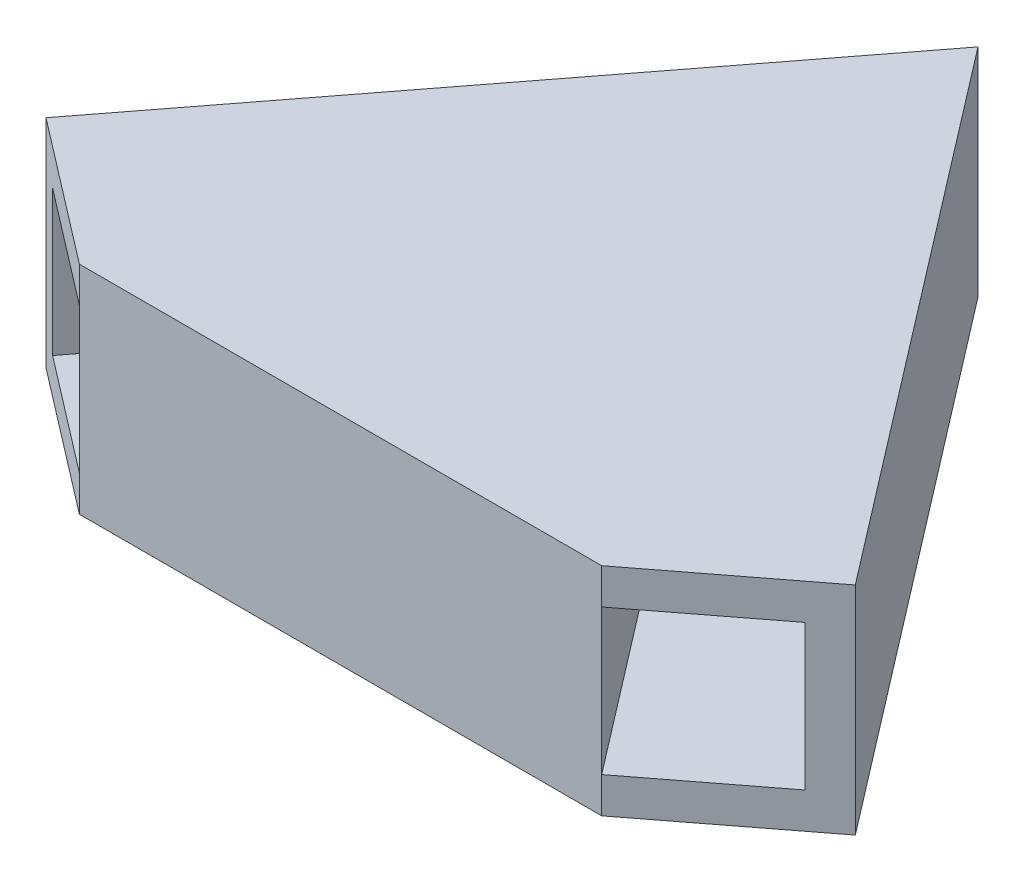
ISO-10303-21;
HEADER;
FILE_DESCRIPTION(('STEP AP214'),'2;1');
FILE_NAME('part.step','',(''),(''),'','','');
FILE_SCHEMA(('AUTOMOTIVE_DESIGN { 1 0 10303 214 1 1 1 1 }'));
ENDSEC;
DATA;
#1=APPLICATION_CONTEXT('core data for automotive mechanical design processes');
#2=APPLICATION_PROTOCOL_DEFINITION('international standard','automotive_design',2000,#1);
#3=PRODUCT_CONTEXT('',#1,'mechanical');
#4=PRODUCT('Part','Part','',(#3));
#5=PRODUCT_RELATED_PRODUCT_CATEGORY('part','',(#4));
#6=PRODUCT_DEFINITION_FORMATION('','',#4);
#7=PRODUCT_DEFINITION_CONTEXT('part definition',#1,'design');
#8=PRODUCT_DEFINITION('design','',#6,#7);
#9=PRODUCT_DEFINITION_SHAPE('','',#8);
#10=(LENGTH_UNIT() NAMED_UNIT(*) SI_UNIT(.MILLI.,.METRE.));
#11=(NAMED_UNIT(*) PLANE_ANGLE_UNIT() SI_UNIT($,.RADIAN.));
#12=(NAMED_UNIT(*) SI_UNIT($,.STERADIAN.) SOLID_ANGLE_UNIT());
#13=UNCERTAINTY_MEASURE_WITH_UNIT(LENGTH_MEASURE(1.E-05),#10,'distance_accuracy_value','');
#14=(GEOMETRIC_REPRESENTATION_CONTEXT(3) GLOBAL_UNCERTAINTY_ASSIGNED_CONTEXT((#13)) GLOBAL_UNIT_ASSIGNED_CONTEXT((#10,
#11,#12)) REPRESENTATION_CONTEXT('',''));
#15=CARTESIAN_POINT('',(0.,0.,0.));
#16=DIRECTION('',(0.,0.,1.));
#17=DIRECTION('',(1.,0.,0.));
#18=AXIS2_PLACEMENT_3D('',#15,#16,#17);
#19=CARTESIAN_POINT('',(0.,5.,0.));
#20=DIRECTION('',(0.,-1.,0.));
#21=DIRECTION('',(0.,0.,-1.));
#22=AXIS2_PLACEMENT_3D('',#19,#20,#21);
#23=PLANE('',#22);
#24=DIRECTION('',(-0.608761429008711,0.,0.793353340291243));
#25=VECTOR('',#24,1.);
#26=CARTESIAN_POINT('',(-36.5256857405226,5.,47.6012004174746));
#27=LINE('',#26,#25);
#28=CARTESIAN_POINT('',(-0.926476193621818,5.,1.20740728286133));
#29=VERTEX_POINT('',#28);
#30=CARTESIAN_POINT('',(-36.5256857405226,5.,47.6012004174746));
#31=VERTEX_POINT('',#30);
#32=EDGE_CURVE('E181',#29,#31,#27,.T.);
#33=ORIENTED_EDGE('',*,*,#32,.F.);
#34=DIRECTION('',(0.793353340291243,0.,0.608761429008711));
#35=VECTOR('',#34,1.);
#36=CARTESIAN_POINT('',(-17.0315490015341,5.,-11.1504497260155));
#37=LINE('',#36,#35);
#38=CARTESIAN_POINT('',(-17.0315490015341,5.,-11.1504497260155));
#39=VERTEX_POINT('',#38);
#40=EDGE_CURVE('E192',#39,#29,#37,.T.);
#41=ORIENTED_EDGE('',*,*,#40,.F.);
#42=DIRECTION('',(0.608761429008711,0.,-0.793353340291243));
#43=VECTOR('',#42,1.);
#44=CARTESIAN_POINT('',(0.,5.,-33.3463965236036));
#45=LINE('',#44,#43);
#46=CARTESIAN_POINT('',(-52.6307585484349,5.,35.2433434085977));
#47=VERTEX_POINT('',#46);
#48=EDGE_CURVE('E211',#47,#39,#45,.T.);
#49=ORIENTED_EDGE('',*,*,#48,.F.);
#50=DIRECTION('',(0.793353340291243,0.,0.60876142900871));
#51=VECTOR('',#50,1.);
#52=CARTESIAN_POINT('',(-36.5256857405226,5.,47.6012004174746));
#53=LINE('',#52,#51);
#54=EDGE_CURVE('E221',#47,#31,#53,.T.);
#55=ORIENTED_EDGE('',*,*,#54,.T.);
#56=EDGE_LOOP('',(#33,#41,#49,#55));
#57=FACE_BOUND('',#56,.T.);
#58=ADVANCED_FACE('F32',(#57),#23,.F.);
#59=CARTESIAN_POINT('',(0.,25.3,0.));
#60=DIRECTION('',(0.,1.,0.));
#61=DIRECTION('',(0.,0.,1.));
#62=AXIS2_PLACEMENT_3D('',#59,#60,#61);
#63=PLANE('',#62);
#64=DIRECTION('',(-0.608761429008711,0.,0.793353340291243));
#65=VECTOR('',#64,1.);
#66=CARTESIAN_POINT('',(-36.5256857405226,25.3,47.6012004174746));
#67=LINE('',#66,#65);
#68=CARTESIAN_POINT('',(-0.926476193621812,25.3,1.20740728286134));
#69=VERTEX_POINT('',#68);
#70=CARTESIAN_POINT('',(-36.5256857405226,25.3,47.6012004174746));
#71=VERTEX_POINT('',#70);
#72=EDGE_CURVE('E184',#69,#71,#67,.T.);
#73=ORIENTED_EDGE('',*,*,#72,.T.);
#74=DIRECTION('',(0.793353340291243,0.,0.60876142900871));
#75=VECTOR('',#74,1.);
#76=CARTESIAN_POINT('',(-56.5975252498911,25.3,32.1995362635542));
#77=LINE('',#76,#75);
#78=CARTESIAN_POINT('',(-52.6307585484349,25.3,35.2433434085977));
#79=VERTEX_POINT('',#78);
#80=EDGE_CURVE('E197',#79,#71,#77,.T.);
#81=ORIENTED_EDGE('',*,*,#80,.F.);
#82=DIRECTION('',(0.608761429008711,0.,-0.793353340291243));
#83=VECTOR('',#82,1.);
#84=CARTESIAN_POINT('',(0.,25.3,-33.3463965236036));
#85=LINE('',#84,#83);
#86=CARTESIAN_POINT('',(-17.0315490015341,25.3,-11.1504497260155));
#87=VERTEX_POINT('',#86);
#88=EDGE_CURVE('E212',#79,#87,#85,.T.);
#89=ORIENTED_EDGE('',*,*,#88,.T.);
#90=DIRECTION('',(0.793353340291243,0.,0.608761429008711));
#91=VECTOR('',#90,1.);
#92=CARTESIAN_POINT('',(-17.0315490015341,25.3,-11.1504497260155));
#93=LINE('',#92,#91);
#94=EDGE_CURVE('E194',#87,#69,#93,.T.);
#95=ORIENTED_EDGE('',*,*,#94,.T.);
#96=EDGE_LOOP('',(#73,#81,#89,#95));
#97=FACE_BOUND('',#96,.T.);
#98=ADVANCED_FACE('F273',(#97),#63,.F.);
#99=CARTESIAN_POINT('',(-17.0315490015341,64.4621464483065,-11.1504497260155));
#100=DIRECTION('',(0.608761429008711,0.,-0.793353340291243));
#101=DIRECTION('',(-0.793353340291243,0.,-0.608761429008711));
#102=AXIS2_PLACEMENT_3D('',#99,#100,#101);
#103=PLANE('',#102);
#104=DIRECTION('',(0.,-1.,0.));
#105=VECTOR('',#104,1.);
#106=CARTESIAN_POINT('',(-0.926476193621818,84.3466744214499,1.20740728286133));
#107=LINE('',#106,#105);
#108=EDGE_CURVE('E185',#69,#29,#107,.T.);
#109=ORIENTED_EDGE('',*,*,#108,.F.);
#110=ORIENTED_EDGE('',*,*,#94,.F.);
#111=DIRECTION('',(0.,-1.,0.));
#112=VECTOR('',#111,1.);
#113=CARTESIAN_POINT('',(-17.0315490015341,64.4621464483065,-11.1504497260155));
#114=LINE('',#113,#112);
#115=EDGE_CURVE('E187',#87,#39,#114,.T.);
#116=ORIENTED_EDGE('',*,*,#115,.T.);
#117=ORIENTED_EDGE('',*,*,#40,.T.);
#118=EDGE_LOOP('',(#109,#110,#116,#117));
#119=FACE_BOUND('',#118,.T.);
#120=ADVANCED_FACE('F275',(#119),#103,.F.);
#121=CARTESIAN_POINT('',(0.,25.3,-33.3463965236036));
#122=DIRECTION('',(-0.793353340291243,0.,-0.608761429008711));
#123=DIRECTION('',(-0.608761429008711,0.,0.793353340291243));
#124=AXIS2_PLACEMENT_3D('',#121,#122,#123);
#125=PLANE('',#124);
#126=ORIENTED_EDGE('',*,*,#115,.F.);
#127=ORIENTED_EDGE('',*,*,#88,.F.);
#128=DIRECTION('',(0.,-1.,0.));
#129=VECTOR('',#128,1.);
#130=CARTESIAN_POINT('',(-52.6307585484349,25.3,35.2433434085977));
#131=LINE('',#130,#129);
#132=EDGE_CURVE('E215',#79,#47,#131,.T.);
#133=ORIENTED_EDGE('',*,*,#132,.T.);
#134=ORIENTED_EDGE('',*,*,#48,.T.);
#135=EDGE_LOOP('',(#126,#127,#133,#134));
#136=FACE_BOUND('',#135,.T.);
#137=ADVANCED_FACE('F270',(#136),#125,.F.);
#138=CARTESIAN_POINT('',(-36.5256857405226,5.,47.6012004174746));
#139=DIRECTION('',(0.60876142900871,0.,-0.793353340291243));
#140=DIRECTION('',(-0.793353340291243,0.,-0.608761429008711));
#141=AXIS2_PLACEMENT_3D('',#138,#139,#140);
#142=PLANE('',#141);
#143=DIRECTION('',(0.793353340291243,0.,0.60876142900871));
#144=VECTOR('',#143,1.);
#145=CARTESIAN_POINT('',(-36.5256857405226,0.,47.6012004174746));
#146=LINE('',#145,#144);
#147=CARTESIAN_POINT('',(-56.5975252498911,0.,32.1995362635542));
#148=VERTEX_POINT('',#147);
#149=CARTESIAN_POINT('',(-36.5256857405226,0.,47.6012004174746));
#150=VERTEX_POINT('',#149);
#151=EDGE_CURVE('E220',#148,#150,#146,.T.);
#152=ORIENTED_EDGE('',*,*,#151,.T.);
#153=DIRECTION('',(0.,-1.,0.));
#154=VECTOR('',#153,1.);
#155=CARTESIAN_POINT('',(-36.5256857405226,5.,47.6012004174746));
#156=LINE('',#155,#154);
#157=EDGE_CURVE('E11',#31,#150,#156,.T.);
#158=ORIENTED_EDGE('',*,*,#157,.F.);
#159=ORIENTED_EDGE('',*,*,#54,.F.);
#160=ORIENTED_EDGE('',*,*,#132,.F.);
#161=ORIENTED_EDGE('',*,*,#80,.T.);
#162=DIRECTION('',(0.,-1.,0.));
#163=VECTOR('',#162,1.);
#164=CARTESIAN_POINT('',(-36.5256857405226,30.3,47.6012004174746));
#165=LINE('',#164,#163);
#166=CARTESIAN_POINT('',(-36.5256857405226,30.3,47.6012004174746));
#167=VERTEX_POINT('',#166);
#168=EDGE_CURVE('E206',#167,#71,#165,.T.);
#169=ORIENTED_EDGE('',*,*,#168,.F.);
#170=DIRECTION('',(0.793353340291243,0.,0.60876142900871));
#171=VECTOR('',#170,1.);
#172=CARTESIAN_POINT('',(-56.5975252498911,30.3,32.1995362635542));
#173=LINE('',#172,#171);
#174=CARTESIAN_POINT('',(-56.5975252498911,30.3,32.1995362635542));
#175=VERTEX_POINT('',#174);
#176=EDGE_CURVE('E202',#175,#167,#173,.T.);
#177=ORIENTED_EDGE('',*,*,#176,.F.);
#178=DIRECTION('',(0.,-1.,0.));
#179=VECTOR('',#178,1.);
#180=CARTESIAN_POINT('',(-56.5975252498911,5.,32.1995362635542));
#181=LINE('',#180,#179);
#182=EDGE_CURVE('E223',#175,#148,#181,.T.);
#183=ORIENTED_EDGE('',*,*,#182,.T.);
#184=EDGE_LOOP('',(#152,#158,#159,#160,#161,#169,#177,#183));
#185=FACE_BOUND('',#184,.T.);
#186=ADVANCED_FACE('F34',(#185),#142,.F.);
#187=CARTESIAN_POINT('',(0.,5.,47.6012004174746));
#188=DIRECTION('',(0.,0.,-1.));
#189=DIRECTION('',(-1.,0.,0.));
#190=AXIS2_PLACEMENT_3D('',#187,#188,#189);
#191=PLANE('',#190);
#192=DIRECTION('',(1.,0.,0.));
#193=VECTOR('',#192,1.);
#194=CARTESIAN_POINT('',(0.,0.,47.6012004174746));
#195=LINE('',#194,#193);
#196=CARTESIAN_POINT('',(36.5256857405226,0.,47.6012004174746));
#197=VERTEX_POINT('',#196);
#198=EDGE_CURVE('E227',#150,#197,#195,.T.);
#199=ORIENTED_EDGE('',*,*,#198,.T.);
#200=DIRECTION('',(0.,-1.,0.));
#201=VECTOR('',#200,1.);
#202=CARTESIAN_POINT('',(36.5256857405226,5.,47.6012004174746));
#203=LINE('',#202,#201);
#204=CARTESIAN_POINT('',(36.5256857405226,5.,47.6012004174746));
#205=VERTEX_POINT('',#204);
#206=EDGE_CURVE('E170',#205,#197,#203,.T.);
#207=ORIENTED_EDGE('',*,*,#206,.F.);
#208=DIRECTION('',(0.,-1.,0.));
#209=VECTOR('',#208,1.);
#210=CARTESIAN_POINT('',(36.5256857405226,84.3466744214499,47.6012004174746));
#211=LINE('',#210,#209);
#212=CARTESIAN_POINT('',(36.5256857405226,25.3,47.6012004174746));
#213=VERTEX_POINT('',#212);
#214=EDGE_CURVE('E138',#213,#205,#211,.T.);
#215=ORIENTED_EDGE('',*,*,#214,.F.);
#216=DIRECTION('',(0.,-1.,0.));
#217=VECTOR('',#216,1.);
#218=CARTESIAN_POINT('',(36.5256857405226,30.3,47.6012004174746));
#219=LINE('',#218,#217);
#220=CARTESIAN_POINT('',(36.5256857405226,30.3,47.6012004174746));
#221=VERTEX_POINT('',#220);
#222=EDGE_CURVE('E155',#221,#213,#219,.T.);
#223=ORIENTED_EDGE('',*,*,#222,.F.);
#224=DIRECTION('',(1.,0.,0.));
#225=VECTOR('',#224,1.);
#226=CARTESIAN_POINT('',(-36.5256857405226,30.3,47.6012004174746));
#227=LINE('',#226,#225);
#228=EDGE_CURVE('E204',#167,#221,#227,.T.);
#229=ORIENTED_EDGE('',*,*,#228,.F.);
#230=ORIENTED_EDGE('',*,*,#168,.T.);
#231=DIRECTION('',(0.,-1.,0.));
#232=VECTOR('',#231,1.);
#233=CARTESIAN_POINT('',(-36.5256857405226,84.3466744214499,47.6012004174746));
#234=LINE('',#233,#232);
#235=EDGE_CURVE('E180',#71,#31,#234,.T.);
#236=ORIENTED_EDGE('',*,*,#235,.T.);
#237=ORIENTED_EDGE('',*,*,#157,.T.);
#238=EDGE_LOOP('',(#199,#207,#215,#223,#229,#230,#236,#237));
#239=FACE_BOUND('',#238,.T.);
#240=ADVANCED_FACE('F259',(#239),#191,.F.);
#241=CARTESIAN_POINT('',(-56.5975252498911,5.,32.1995362635542));
#242=DIRECTION('',(0.793353340291243,0.,0.608761429008711));
#243=DIRECTION('',(0.608761429008711,0.,-0.793353340291243));
#244=AXIS2_PLACEMENT_3D('',#241,#242,#243);
#245=PLANE('',#244);
#246=DIRECTION('',(-0.608761429008711,0.,0.793353340291243));
#247=VECTOR('',#246,1.);
#248=CARTESIAN_POINT('',(-56.5975252498911,0.,32.1995362635542));
#249=LINE('',#248,#247);
#250=CARTESIAN_POINT('',(0.,0.,-41.5597946821266));
#251=VERTEX_POINT('',#250);
#252=EDGE_CURVE('E224',#251,#148,#249,.T.);
#253=ORIENTED_EDGE('',*,*,#252,.T.);
#254=ORIENTED_EDGE('',*,*,#182,.F.);
#255=DIRECTION('',(-0.608761429008711,0.,0.793353340291243));
#256=VECTOR('',#255,1.);
#257=CARTESIAN_POINT('',(0.,30.3,-41.5597946821266));
#258=LINE('',#257,#256);
#259=CARTESIAN_POINT('',(0.,30.3,-41.5597946821266));
#260=VERTEX_POINT('',#259);
#261=EDGE_CURVE('E199',#260,#175,#258,.T.);
#262=ORIENTED_EDGE('',*,*,#261,.F.);
#263=DIRECTION('',(0.,-1.,0.));
#264=VECTOR('',#263,1.);
#265=CARTESIAN_POINT('',(0.,5.,-41.5597946821266));
#266=LINE('',#265,#264);
#267=EDGE_CURVE('E40',#260,#251,#266,.T.);
#268=ORIENTED_EDGE('',*,*,#267,.T.);
#269=EDGE_LOOP('',(#253,#254,#262,#268));
#270=FACE_BOUND('',#269,.T.);
#271=ADVANCED_FACE('F234',(#270),#245,.F.);
#272=CARTESIAN_POINT('',(0.,0.,0.));
#273=DIRECTION('',(0.,-1.,0.));
#274=DIRECTION('',(0.,0.,-1.));
#275=AXIS2_PLACEMENT_3D('',#272,#273,#274);
#276=PLANE('',#275);
#277=ORIENTED_EDGE('',*,*,#151,.F.);
#278=ORIENTED_EDGE('',*,*,#252,.F.);
#279=DIRECTION('',(0.608761429008711,0.,0.793353340291243));
#280=VECTOR('',#279,1.);
#281=CARTESIAN_POINT('',(56.5975252498911,0.,32.1995362635542));
#282=LINE('',#281,#280);
#283=CARTESIAN_POINT('',(56.5975252498911,0.,32.1995362635542));
#284=VERTEX_POINT('',#283);
#285=EDGE_CURVE('E171',#251,#284,#282,.T.);
#286=ORIENTED_EDGE('',*,*,#285,.T.);
#287=DIRECTION('',(-0.793353340291243,0.,0.608761429008711));
#288=VECTOR('',#287,1.);
#289=CARTESIAN_POINT('',(36.5256857405226,0.,47.6012004174746));
#290=LINE('',#289,#288);
#291=EDGE_CURVE('E166',#284,#197,#290,.T.);
#292=ORIENTED_EDGE('',*,*,#291,.T.);
#293=ORIENTED_EDGE('',*,*,#198,.F.);
#294=EDGE_LOOP('',(#277,#278,#286,#292,#293));
#295=FACE_BOUND('',#294,.T.);
#296=ADVANCED_FACE('F242',(#295),#276,.T.);
#297=CARTESIAN_POINT('',(0.,30.3,0.));
#298=DIRECTION('',(0.,1.,0.));
#299=DIRECTION('',(0.,0.,1.));
#300=AXIS2_PLACEMENT_3D('',#297,#298,#299);
#301=PLANE('',#300);
#302=ORIENTED_EDGE('',*,*,#261,.T.);
#303=ORIENTED_EDGE('',*,*,#176,.T.);
#304=ORIENTED_EDGE('',*,*,#228,.T.);
#305=DIRECTION('',(-0.793353340291243,0.,0.608761429008711));
#306=VECTOR('',#305,1.);
#307=CARTESIAN_POINT('',(56.5975252498911,30.3,32.1995362635542));
#308=LINE('',#307,#306);
#309=CARTESIAN_POINT('',(56.5975252498911,30.3,32.1995362635542));
#310=VERTEX_POINT('',#309);
#311=EDGE_CURVE('E152',#310,#221,#308,.T.);
#312=ORIENTED_EDGE('',*,*,#311,.F.);
#313=DIRECTION('',(0.608761429008711,0.,0.793353340291243));
#314=VECTOR('',#313,1.);
#315=CARTESIAN_POINT('',(0.,30.3,-41.5597946821266));
#316=LINE('',#315,#314);
#317=EDGE_CURVE('E149',#260,#310,#316,.T.);
#318=ORIENTED_EDGE('',*,*,#317,.F.);
#319=EDGE_LOOP('',(#302,#303,#304,#312,#318));
#320=FACE_BOUND('',#319,.T.);
#321=ADVANCED_FACE('F250',(#320),#301,.T.);
#322=CARTESIAN_POINT('',(-36.5256857405226,84.3466744214499,47.6012004174746));
#323=DIRECTION('',(0.793353340291243,0.,0.608761429008711));
#324=DIRECTION('',(0.608761429008711,0.,-0.793353340291243));
#325=AXIS2_PLACEMENT_3D('',#322,#323,#324);
#326=PLANE('',#325);
#327=ORIENTED_EDGE('',*,*,#72,.F.);
#328=ORIENTED_EDGE('',*,*,#108,.T.);
#329=ORIENTED_EDGE('',*,*,#32,.T.);
#330=ORIENTED_EDGE('',*,*,#235,.F.);
#331=EDGE_LOOP('',(#327,#328,#329,#330));
#332=FACE_BOUND('',#331,.T.);
#333=ADVANCED_FACE('F264',(#332),#326,.F.);
#334=CARTESIAN_POINT('',(36.5256857405226,5.,47.6012004174746));
#335=DIRECTION('',(0.608761429008711,0.,0.793353340291243));
#336=DIRECTION('',(0.793353340291243,0.,-0.608761429008711));
#337=AXIS2_PLACEMENT_3D('',#334,#335,#336);
#338=PLANE('',#337);
#339=ORIENTED_EDGE('',*,*,#291,.F.);
#340=DIRECTION('',(0.,-1.,0.));
#341=VECTOR('',#340,1.);
#342=CARTESIAN_POINT('',(56.5975252498911,5.,32.1995362635542));
#343=LINE('',#342,#341);
#344=EDGE_CURVE('E178',#310,#284,#343,.T.);
#345=ORIENTED_EDGE('',*,*,#344,.F.);
#346=ORIENTED_EDGE('',*,*,#311,.T.);
#347=ORIENTED_EDGE('',*,*,#222,.T.);
#348=DIRECTION('',(-0.793353340291243,0.,0.608761429008711));
#349=VECTOR('',#348,1.);
#350=CARTESIAN_POINT('',(56.5975252498911,25.3,32.1995362635542));
#351=LINE('',#350,#349);
#352=CARTESIAN_POINT('',(52.6307585484349,25.3,35.2433434085977));
#353=VERTEX_POINT('',#352);
#354=EDGE_CURVE('E134',#353,#213,#351,.T.);
#355=ORIENTED_EDGE('',*,*,#354,.F.);
#356=DIRECTION('',(0.,-1.,0.));
#357=VECTOR('',#356,1.);
#358=CARTESIAN_POINT('',(52.6307585484349,25.3,35.2433434085977));
#359=LINE('',#358,#357);
#360=CARTESIAN_POINT('',(52.6307585484349,5.,35.2433434085977));
#361=VERTEX_POINT('',#360);
#362=EDGE_CURVE('E161',#353,#361,#359,.T.);
#363=ORIENTED_EDGE('',*,*,#362,.T.);
#364=DIRECTION('',(-0.793353340291243,0.,0.608761429008711));
#365=VECTOR('',#364,1.);
#366=CARTESIAN_POINT('',(36.5256857405226,5.,47.6012004174746));
#367=LINE('',#366,#365);
#368=EDGE_CURVE('E167',#361,#205,#367,.T.);
#369=ORIENTED_EDGE('',*,*,#368,.T.);
#370=ORIENTED_EDGE('',*,*,#206,.T.);
#371=EDGE_LOOP('',(#339,#345,#346,#347,#355,#363,#369,#370));
#372=FACE_BOUND('',#371,.T.);
#373=ADVANCED_FACE('F254',(#372),#338,.T.);
#374=CARTESIAN_POINT('',(56.5975252498911,5.,32.1995362635542));
#375=DIRECTION('',(0.793353340291243,0.,-0.608761429008711));
#376=DIRECTION('',(-0.608761429008711,0.,-0.793353340291243));
#377=AXIS2_PLACEMENT_3D('',#374,#375,#376);
#378=PLANE('',#377);
#379=ORIENTED_EDGE('',*,*,#285,.F.);
#380=ORIENTED_EDGE('',*,*,#267,.F.);
#381=ORIENTED_EDGE('',*,*,#317,.T.);
#382=ORIENTED_EDGE('',*,*,#344,.T.);
#383=EDGE_LOOP('',(#379,#380,#381,#382));
#384=FACE_BOUND('',#383,.T.);
#385=ADVANCED_FACE('F238',(#384),#378,.T.);
#386=CARTESIAN_POINT('',(0.,5.,0.));
#387=DIRECTION('',(0.,-1.,0.));
#388=DIRECTION('',(0.,0.,-1.));
#389=AXIS2_PLACEMENT_3D('',#386,#387,#388);
#390=PLANE('',#389);
#391=DIRECTION('',(-0.793353340291243,0.,0.608761429008711));
#392=VECTOR('',#391,1.);
#393=CARTESIAN_POINT('',(17.0315490015341,5.,-11.1504497260155));
#394=LINE('',#393,#392);
#395=CARTESIAN_POINT('',(17.0315490015341,5.,-11.1504497260155));
#396=VERTEX_POINT('',#395);
#397=CARTESIAN_POINT('',(0.926476193621816,5.,1.20740728286134));
#398=VERTEX_POINT('',#397);
#399=EDGE_CURVE('E129',#396,#398,#394,.T.);
#400=ORIENTED_EDGE('',*,*,#399,.T.);
#401=DIRECTION('',(0.608761429008711,0.,0.793353340291242));
#402=VECTOR('',#401,1.);
#403=CARTESIAN_POINT('',(36.5256857405226,5.,47.6012004174746));
#404=LINE('',#403,#402);
#405=EDGE_CURVE('E142',#398,#205,#404,.T.);
#406=ORIENTED_EDGE('',*,*,#405,.T.);
#407=ORIENTED_EDGE('',*,*,#368,.F.);
#408=DIRECTION('',(-0.608761429008711,0.,-0.793353340291243));
#409=VECTOR('',#408,1.);
#410=CARTESIAN_POINT('',(0.,5.,-33.3463965236036));
#411=LINE('',#410,#409);
#412=EDGE_CURVE('E158',#361,#396,#411,.T.);
#413=ORIENTED_EDGE('',*,*,#412,.T.);
#414=EDGE_LOOP('',(#400,#406,#407,#413));
#415=FACE_BOUND('',#414,.T.);
#416=ADVANCED_FACE('F387',(#415),#390,.F.);
#417=CARTESIAN_POINT('',(0.,25.3,-33.3463965236036));
#418=DIRECTION('',(-0.793353340291243,0.,0.608761429008711));
#419=DIRECTION('',(0.608761429008711,0.,0.793353340291243));
#420=AXIS2_PLACEMENT_3D('',#417,#418,#419);
#421=PLANE('',#420);
#422=DIRECTION('',(0.,-1.,0.));
#423=VECTOR('',#422,1.);
#424=CARTESIAN_POINT('',(17.0315490015341,64.4621464483065,-11.1504497260155));
#425=LINE('',#424,#423);
#426=CARTESIAN_POINT('',(17.0315490015341,25.3,-11.1504497260155));
#427=VERTEX_POINT('',#426);
#428=EDGE_CURVE('E52',#427,#396,#425,.T.);
#429=ORIENTED_EDGE('',*,*,#428,.T.);
#430=ORIENTED_EDGE('',*,*,#412,.F.);
#431=ORIENTED_EDGE('',*,*,#362,.F.);
#432=DIRECTION('',(-0.608761429008711,0.,-0.793353340291243));
#433=VECTOR('',#432,1.);
#434=CARTESIAN_POINT('',(0.,25.3,-33.3463965236036));
#435=LINE('',#434,#433);
#436=EDGE_CURVE('E159',#353,#427,#435,.T.);
#437=ORIENTED_EDGE('',*,*,#436,.T.);
#438=EDGE_LOOP('',(#429,#430,#431,#437));
#439=FACE_BOUND('',#438,.T.);
#440=ADVANCED_FACE('F398',(#439),#421,.T.);
#441=CARTESIAN_POINT('',(0.,25.3,0.));
#442=DIRECTION('',(0.,1.,0.));
#443=DIRECTION('',(0.,0.,1.));
#444=AXIS2_PLACEMENT_3D('',#441,#442,#443);
#445=PLANE('',#444);
#446=ORIENTED_EDGE('',*,*,#354,.T.);
#447=DIRECTION('',(0.608761429008711,0.,0.793353340291243));
#448=VECTOR('',#447,1.);
#449=CARTESIAN_POINT('',(36.5256857405226,25.3,47.6012004174746));
#450=LINE('',#449,#448);
#451=CARTESIAN_POINT('',(0.926476193621818,25.3,1.20740728286133));
#452=VERTEX_POINT('',#451);
#453=EDGE_CURVE('E132',#452,#213,#450,.T.);
#454=ORIENTED_EDGE('',*,*,#453,.F.);
#455=DIRECTION('',(-0.793353340291243,0.,0.608761429008711));
#456=VECTOR('',#455,1.);
#457=CARTESIAN_POINT('',(17.0315490015341,25.3,-11.1504497260155));
#458=LINE('',#457,#456);
#459=EDGE_CURVE('E123',#427,#452,#458,.T.);
#460=ORIENTED_EDGE('',*,*,#459,.F.);
#461=ORIENTED_EDGE('',*,*,#436,.F.);
#462=EDGE_LOOP('',(#446,#454,#460,#461));
#463=FACE_BOUND('',#462,.T.);
#464=ADVANCED_FACE('F133',(#463),#445,.F.);
#465=CARTESIAN_POINT('',(17.0315490015341,64.4621464483065,-11.1504497260155));
#466=DIRECTION('',(0.608761429008711,0.,0.793353340291243));
#467=DIRECTION('',(0.793353340291243,0.,-0.608761429008711));
#468=AXIS2_PLACEMENT_3D('',#465,#466,#467);
#469=PLANE('',#468);
#470=DIRECTION('',(0.,-1.,0.));
#471=VECTOR('',#470,1.);
#472=CARTESIAN_POINT('',(0.926476193621818,84.3466744214499,1.20740728286133));
#473=LINE('',#472,#471);
#474=EDGE_CURVE('E47',#452,#398,#473,.T.);
#475=ORIENTED_EDGE('',*,*,#474,.T.);
#476=ORIENTED_EDGE('',*,*,#399,.F.);
#477=ORIENTED_EDGE('',*,*,#428,.F.);
#478=ORIENTED_EDGE('',*,*,#459,.T.);
#479=EDGE_LOOP('',(#475,#476,#477,#478));
#480=FACE_BOUND('',#479,.T.);
#481=ADVANCED_FACE('F125',(#480),#469,.T.);
#482=CARTESIAN_POINT('',(36.5256857405226,84.3466744214499,47.6012004174746));
#483=DIRECTION('',(0.793353340291243,0.,-0.608761429008711));
#484=DIRECTION('',(-0.608761429008711,0.,-0.793353340291243));
#485=AXIS2_PLACEMENT_3D('',#482,#483,#484);
#486=PLANE('',#485);
#487=ORIENTED_EDGE('',*,*,#474,.F.);
#488=ORIENTED_EDGE('',*,*,#453,.T.);
#489=ORIENTED_EDGE('',*,*,#214,.T.);
#490=ORIENTED_EDGE('',*,*,#405,.F.);
#491=EDGE_LOOP('',(#487,#488,#489,#490));
#492=FACE_BOUND('',#491,.T.);
#493=ADVANCED_FACE('F141',(#492),#486,.T.);
#494=CLOSED_SHELL('',(#58,#98,#120,#137,#186,#240,#271,#296,#321,#333,#373,#385,#416,#440,#464,
#481,#493));
#495=MANIFOLD_SOLID_BREP('B2',#494);
#496=ADVANCED_BREP_SHAPE_REPRESENTATION('',(#18,#495),#14);
#497=SHAPE_DEFINITION_REPRESENTATION(#9,#496);
ENDSEC;
END-ISO-10303-21;
